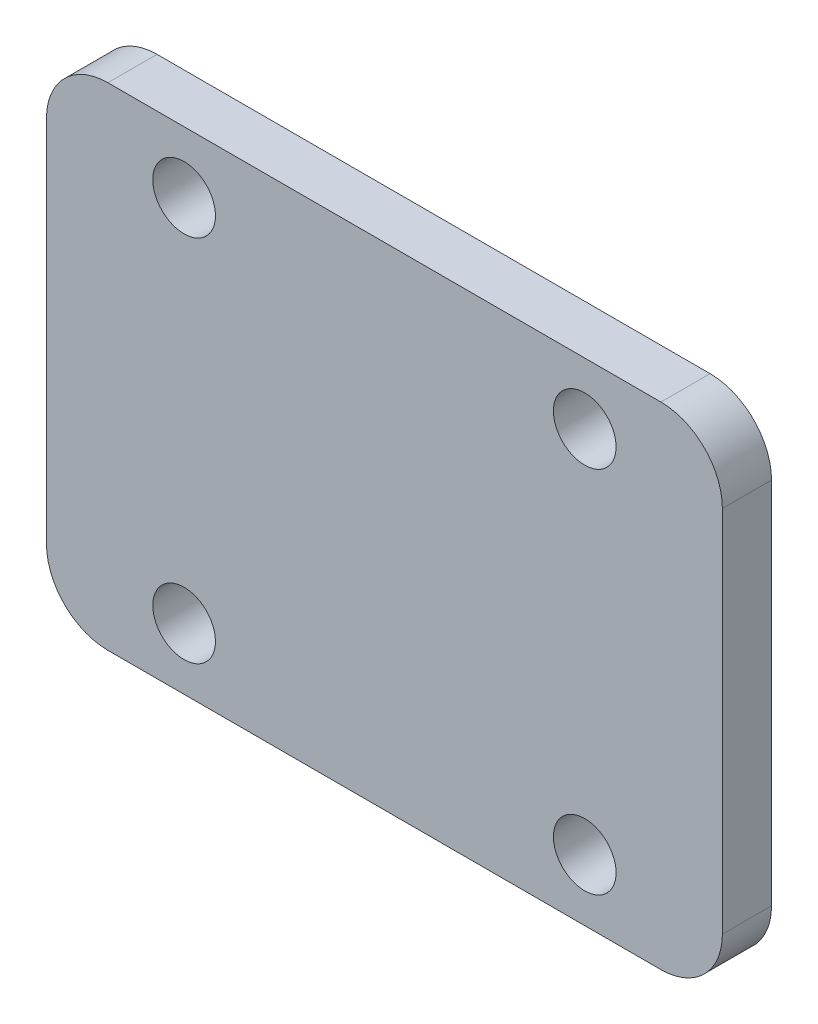
ISO-10303-21;
HEADER;
FILE_DESCRIPTION(('STEP AP214'),'2;1');
FILE_NAME('part.step','',(''),(''),'','','');
FILE_SCHEMA(('AUTOMOTIVE_DESIGN { 1 0 10303 214 1 1 1 1 }'));
ENDSEC;
DATA;
#1=APPLICATION_CONTEXT('core data for automotive mechanical design processes');
#2=APPLICATION_PROTOCOL_DEFINITION('international standard','automotive_design',2000,#1);
#3=PRODUCT_CONTEXT('',#1,'mechanical');
#4=PRODUCT('Part','Part','',(#3));
#5=PRODUCT_RELATED_PRODUCT_CATEGORY('part','',(#4));
#6=PRODUCT_DEFINITION_FORMATION('','',#4);
#7=PRODUCT_DEFINITION_CONTEXT('part definition',#1,'design');
#8=PRODUCT_DEFINITION('design','',#6,#7);
#9=PRODUCT_DEFINITION_SHAPE('','',#8);
#10=(LENGTH_UNIT() NAMED_UNIT(*) SI_UNIT(.MILLI.,.METRE.));
#11=(NAMED_UNIT(*) PLANE_ANGLE_UNIT() SI_UNIT($,.RADIAN.));
#12=(NAMED_UNIT(*) SI_UNIT($,.STERADIAN.) SOLID_ANGLE_UNIT());
#13=UNCERTAINTY_MEASURE_WITH_UNIT(LENGTH_MEASURE(1.E-05),#10,'distance_accuracy_value','');
#14=(GEOMETRIC_REPRESENTATION_CONTEXT(3) GLOBAL_UNCERTAINTY_ASSIGNED_CONTEXT((#13)) GLOBAL_UNIT_ASSIGNED_CONTEXT((#10,
#11,#12)) REPRESENTATION_CONTEXT('',''));
#15=CARTESIAN_POINT('',(0.,0.,0.));
#16=DIRECTION('',(0.,0.,1.));
#17=DIRECTION('',(1.,0.,0.));
#18=AXIS2_PLACEMENT_3D('',#15,#16,#17);
#19=CARTESIAN_POINT('',(-22.5,-15.,4.));
#20=DIRECTION('',(0.,0.,-1.));
#21=DIRECTION('',(-1.,0.,0.));
#22=AXIS2_PLACEMENT_3D('',#19,#20,#21);
#23=PLANE('',#22);
#24=CARTESIAN_POINT('',(-22.5,-15.,4.));
#25=DIRECTION('',(0.,0.,1.));
#26=DIRECTION('',(-1.,0.,0.));
#27=AXIS2_PLACEMENT_3D('',#24,#25,#26);
#28=CIRCLE('',#27,5.);
#29=CARTESIAN_POINT('',(-27.5,-15.,4.));
#30=VERTEX_POINT('',#29);
#31=CARTESIAN_POINT('',(-22.5,-20.,4.));
#32=VERTEX_POINT('',#31);
#33=EDGE_CURVE('E149',#30,#32,#28,.T.);
#34=ORIENTED_EDGE('',*,*,#33,.T.);
#35=DIRECTION('',(1.,0.,0.));
#36=VECTOR('',#35,1.);
#37=CARTESIAN_POINT('',(-22.5,-20.,4.));
#38=LINE('',#37,#36);
#39=CARTESIAN_POINT('',(22.5,-20.,4.));
#40=VERTEX_POINT('',#39);
#41=EDGE_CURVE('E97',#32,#40,#38,.T.);
#42=ORIENTED_EDGE('',*,*,#41,.T.);
#43=CARTESIAN_POINT('',(22.5,-15.,4.));
#44=DIRECTION('',(0.,0.,1.));
#45=DIRECTION('',(1.,0.,0.));
#46=AXIS2_PLACEMENT_3D('',#43,#44,#45);
#47=CIRCLE('',#46,5.);
#48=CARTESIAN_POINT('',(27.5,-15.,4.));
#49=VERTEX_POINT('',#48);
#50=EDGE_CURVE('E164',#40,#49,#47,.T.);
#51=ORIENTED_EDGE('',*,*,#50,.T.);
#52=DIRECTION('',(0.,1.,0.));
#53=VECTOR('',#52,1.);
#54=CARTESIAN_POINT('',(27.5,-15.,4.));
#55=LINE('',#54,#53);
#56=CARTESIAN_POINT('',(27.5,15.,4.));
#57=VERTEX_POINT('',#56);
#58=EDGE_CURVE('E177',#49,#57,#55,.T.);
#59=ORIENTED_EDGE('',*,*,#58,.T.);
#60=CARTESIAN_POINT('',(22.5,15.,4.));
#61=DIRECTION('',(0.,0.,1.));
#62=DIRECTION('',(-1.,0.,0.));
#63=AXIS2_PLACEMENT_3D('',#60,#61,#62);
#64=CIRCLE('',#63,5.);
#65=CARTESIAN_POINT('',(22.5,20.,4.));
#66=VERTEX_POINT('',#65);
#67=EDGE_CURVE('E116',#57,#66,#64,.T.);
#68=ORIENTED_EDGE('',*,*,#67,.T.);
#69=DIRECTION('',(-1.,0.,0.));
#70=VECTOR('',#69,1.);
#71=CARTESIAN_POINT('',(-22.5,20.,4.));
#72=LINE('',#71,#70);
#73=CARTESIAN_POINT('',(-22.5,20.,4.));
#74=VERTEX_POINT('',#73);
#75=EDGE_CURVE('E110',#66,#74,#72,.T.);
#76=ORIENTED_EDGE('',*,*,#75,.T.);
#77=CARTESIAN_POINT('',(-22.5,15.,4.));
#78=DIRECTION('',(0.,0.,1.));
#79=DIRECTION('',(-1.,0.,0.));
#80=AXIS2_PLACEMENT_3D('',#77,#78,#79);
#81=CIRCLE('',#80,5.);
#82=CARTESIAN_POINT('',(-27.5,15.,4.));
#83=VERTEX_POINT('',#82);
#84=EDGE_CURVE('E114',#74,#83,#81,.T.);
#85=ORIENTED_EDGE('',*,*,#84,.T.);
#86=DIRECTION('',(0.,-1.,0.));
#87=VECTOR('',#86,1.);
#88=CARTESIAN_POINT('',(-27.5,-15.,4.));
#89=LINE('',#88,#87);
#90=EDGE_CURVE('E54',#83,#30,#89,.T.);
#91=ORIENTED_EDGE('',*,*,#90,.T.);
#92=EDGE_LOOP('',(#34,#42,#51,#59,#68,#76,#85,#91));
#93=FACE_BOUND('',#92,.T.);
#94=CARTESIAN_POINT('',(-16.3,15.,4.));
#95=DIRECTION('',(0.,0.,1.));
#96=DIRECTION('',(1.,0.,0.));
#97=AXIS2_PLACEMENT_3D('',#94,#95,#96);
#98=CIRCLE('',#97,2.55);
#99=CARTESIAN_POINT('',(-13.75,15.,4.));
#100=VERTEX_POINT('',#99);
#101=EDGE_CURVE('E138',#100,#100,#98,.T.);
#102=ORIENTED_EDGE('',*,*,#101,.F.);
#103=EDGE_LOOP('',(#102));
#104=FACE_BOUND('',#103,.T.);
#105=CARTESIAN_POINT('',(-16.3,-15.,4.));
#106=DIRECTION('',(0.,0.,1.));
#107=DIRECTION('',(-1.,0.,0.));
#108=AXIS2_PLACEMENT_3D('',#105,#106,#107);
#109=CIRCLE('',#108,2.55);
#110=CARTESIAN_POINT('',(-18.85,-15.,4.));
#111=VERTEX_POINT('',#110);
#112=EDGE_CURVE('E186',#111,#111,#109,.T.);
#113=ORIENTED_EDGE('',*,*,#112,.F.);
#114=EDGE_LOOP('',(#113));
#115=FACE_BOUND('',#114,.T.);
#116=CARTESIAN_POINT('',(16.3,-15.,4.));
#117=DIRECTION('',(0.,0.,1.));
#118=DIRECTION('',(1.,0.,0.));
#119=AXIS2_PLACEMENT_3D('',#116,#117,#118);
#120=CIRCLE('',#119,2.55);
#121=CARTESIAN_POINT('',(18.85,-15.,4.));
#122=VERTEX_POINT('',#121);
#123=EDGE_CURVE('E192',#122,#122,#120,.T.);
#124=ORIENTED_EDGE('',*,*,#123,.F.);
#125=EDGE_LOOP('',(#124));
#126=FACE_BOUND('',#125,.T.);
#127=CARTESIAN_POINT('',(16.3,15.,4.));
#128=DIRECTION('',(0.,0.,1.));
#129=DIRECTION('',(-1.,0.,0.));
#130=AXIS2_PLACEMENT_3D('',#127,#128,#129);
#131=CIRCLE('',#130,2.55);
#132=CARTESIAN_POINT('',(13.75,15.,4.));
#133=VERTEX_POINT('',#132);
#134=EDGE_CURVE('E198',#133,#133,#131,.T.);
#135=ORIENTED_EDGE('',*,*,#134,.F.);
#136=EDGE_LOOP('',(#135));
#137=FACE_BOUND('',#136,.T.);
#138=ADVANCED_FACE('F37',(#93,#104,#115,#126,#137),#23,.F.);
#139=CARTESIAN_POINT('',(-22.5,-15.,0.));
#140=DIRECTION('',(0.,0.,-1.));
#141=DIRECTION('',(-1.,0.,0.));
#142=AXIS2_PLACEMENT_3D('',#139,#140,#141);
#143=PLANE('',#142);
#144=CARTESIAN_POINT('',(16.3,-15.,0.));
#145=DIRECTION('',(0.,0.,1.));
#146=DIRECTION('',(1.,0.,0.));
#147=AXIS2_PLACEMENT_3D('',#144,#145,#146);
#148=CIRCLE('',#147,2.55);
#149=CARTESIAN_POINT('',(18.85,-15.,0.));
#150=VERTEX_POINT('',#149);
#151=EDGE_CURVE('E195',#150,#150,#148,.T.);
#152=ORIENTED_EDGE('',*,*,#151,.T.);
#153=EDGE_LOOP('',(#152));
#154=FACE_BOUND('',#153,.T.);
#155=CARTESIAN_POINT('',(-16.3,15.,0.));
#156=DIRECTION('',(0.,0.,1.));
#157=DIRECTION('',(1.,0.,0.));
#158=AXIS2_PLACEMENT_3D('',#155,#156,#157);
#159=CIRCLE('',#158,2.55);
#160=CARTESIAN_POINT('',(-13.75,15.,0.));
#161=VERTEX_POINT('',#160);
#162=EDGE_CURVE('E183',#161,#161,#159,.T.);
#163=ORIENTED_EDGE('',*,*,#162,.T.);
#164=EDGE_LOOP('',(#163));
#165=FACE_BOUND('',#164,.T.);
#166=CARTESIAN_POINT('',(-22.5,-15.,0.));
#167=DIRECTION('',(0.,0.,1.));
#168=DIRECTION('',(-1.,0.,0.));
#169=AXIS2_PLACEMENT_3D('',#166,#167,#168);
#170=CIRCLE('',#169,5.);
#171=CARTESIAN_POINT('',(-27.5,-15.,0.));
#172=VERTEX_POINT('',#171);
#173=CARTESIAN_POINT('',(-22.5,-20.,0.));
#174=VERTEX_POINT('',#173);
#175=EDGE_CURVE('E134',#172,#174,#170,.T.);
#176=ORIENTED_EDGE('',*,*,#175,.F.);
#177=DIRECTION('',(0.,-1.,0.));
#178=VECTOR('',#177,1.);
#179=CARTESIAN_POINT('',(-27.5,-15.,0.));
#180=LINE('',#179,#178);
#181=CARTESIAN_POINT('',(-27.5,15.,0.));
#182=VERTEX_POINT('',#181);
#183=EDGE_CURVE('E89',#182,#172,#180,.T.);
#184=ORIENTED_EDGE('',*,*,#183,.F.);
#185=CARTESIAN_POINT('',(-22.5,15.,0.));
#186=DIRECTION('',(0.,0.,1.));
#187=DIRECTION('',(-1.,0.,0.));
#188=AXIS2_PLACEMENT_3D('',#185,#186,#187);
#189=CIRCLE('',#188,5.);
#190=CARTESIAN_POINT('',(-22.5,20.,0.));
#191=VERTEX_POINT('',#190);
#192=EDGE_CURVE('E83',#191,#182,#189,.T.);
#193=ORIENTED_EDGE('',*,*,#192,.F.);
#194=DIRECTION('',(-1.,0.,0.));
#195=VECTOR('',#194,1.);
#196=CARTESIAN_POINT('',(-22.5,20.,0.));
#197=LINE('',#196,#195);
#198=CARTESIAN_POINT('',(22.5,20.,0.));
#199=VERTEX_POINT('',#198);
#200=EDGE_CURVE('E124',#199,#191,#197,.T.);
#201=ORIENTED_EDGE('',*,*,#200,.F.);
#202=CARTESIAN_POINT('',(22.5,15.,0.));
#203=DIRECTION('',(0.,0.,1.));
#204=DIRECTION('',(-1.,0.,0.));
#205=AXIS2_PLACEMENT_3D('',#202,#203,#204);
#206=CIRCLE('',#205,5.);
#207=CARTESIAN_POINT('',(27.5,15.,0.));
#208=VERTEX_POINT('',#207);
#209=EDGE_CURVE('E144',#208,#199,#206,.T.);
#210=ORIENTED_EDGE('',*,*,#209,.F.);
#211=DIRECTION('',(0.,1.,0.));
#212=VECTOR('',#211,1.);
#213=CARTESIAN_POINT('',(27.5,-15.,0.));
#214=LINE('',#213,#212);
#215=CARTESIAN_POINT('',(27.5,-15.,0.));
#216=VERTEX_POINT('',#215);
#217=EDGE_CURVE('E142',#216,#208,#214,.T.);
#218=ORIENTED_EDGE('',*,*,#217,.F.);
#219=CARTESIAN_POINT('',(22.5,-15.,0.));
#220=DIRECTION('',(0.,0.,1.));
#221=DIRECTION('',(1.,0.,0.));
#222=AXIS2_PLACEMENT_3D('',#219,#220,#221);
#223=CIRCLE('',#222,5.);
#224=CARTESIAN_POINT('',(22.5,-20.,0.));
#225=VERTEX_POINT('',#224);
#226=EDGE_CURVE('E140',#225,#216,#223,.T.);
#227=ORIENTED_EDGE('',*,*,#226,.F.);
#228=DIRECTION('',(1.,0.,0.));
#229=VECTOR('',#228,1.);
#230=CARTESIAN_POINT('',(-22.5,-20.,0.));
#231=LINE('',#230,#229);
#232=EDGE_CURVE('E137',#174,#225,#231,.T.);
#233=ORIENTED_EDGE('',*,*,#232,.F.);
#234=EDGE_LOOP('',(#176,#184,#193,#201,#210,#218,#227,#233));
#235=FACE_BOUND('',#234,.T.);
#236=CARTESIAN_POINT('',(-16.3,-15.,0.));
#237=DIRECTION('',(0.,0.,1.));
#238=DIRECTION('',(-1.,0.,0.));
#239=AXIS2_PLACEMENT_3D('',#236,#237,#238);
#240=CIRCLE('',#239,2.55);
#241=CARTESIAN_POINT('',(-18.85,-15.,0.));
#242=VERTEX_POINT('',#241);
#243=EDGE_CURVE('E189',#242,#242,#240,.T.);
#244=ORIENTED_EDGE('',*,*,#243,.T.);
#245=EDGE_LOOP('',(#244));
#246=FACE_BOUND('',#245,.T.);
#247=CARTESIAN_POINT('',(16.3,15.,0.));
#248=DIRECTION('',(0.,0.,1.));
#249=DIRECTION('',(-1.,0.,0.));
#250=AXIS2_PLACEMENT_3D('',#247,#248,#249);
#251=CIRCLE('',#250,2.55);
#252=CARTESIAN_POINT('',(13.75,15.,0.));
#253=VERTEX_POINT('',#252);
#254=EDGE_CURVE('E201',#253,#253,#251,.T.);
#255=ORIENTED_EDGE('',*,*,#254,.T.);
#256=EDGE_LOOP('',(#255));
#257=FACE_BOUND('',#256,.T.);
#258=ADVANCED_FACE('F168',(#154,#165,#235,#246,#257),#143,.T.);
#259=CARTESIAN_POINT('',(-22.5,-15.,4.));
#260=DIRECTION('',(0.,0.,-1.));
#261=DIRECTION('',(-1.,0.,0.));
#262=AXIS2_PLACEMENT_3D('',#259,#260,#261);
#263=CYLINDRICAL_SURFACE('',#262,5.);
#264=ORIENTED_EDGE('',*,*,#175,.T.);
#265=DIRECTION('',(0.,0.,-1.));
#266=VECTOR('',#265,1.);
#267=CARTESIAN_POINT('',(-22.5,-20.,4.));
#268=LINE('',#267,#266);
#269=EDGE_CURVE('E11',#32,#174,#268,.T.);
#270=ORIENTED_EDGE('',*,*,#269,.F.);
#271=ORIENTED_EDGE('',*,*,#33,.F.);
#272=DIRECTION('',(0.,0.,-1.));
#273=VECTOR('',#272,1.);
#274=CARTESIAN_POINT('',(-27.5,-15.,4.));
#275=LINE('',#274,#273);
#276=EDGE_CURVE('E130',#30,#172,#275,.T.);
#277=ORIENTED_EDGE('',*,*,#276,.T.);
#278=EDGE_LOOP('',(#264,#270,#271,#277));
#279=FACE_BOUND('',#278,.T.);
#280=ADVANCED_FACE('F39',(#279),#263,.T.);
#281=CARTESIAN_POINT('',(-22.5,-20.,4.));
#282=DIRECTION('',(0.,1.,0.));
#283=DIRECTION('',(0.,0.,1.));
#284=AXIS2_PLACEMENT_3D('',#281,#282,#283);
#285=PLANE('',#284);
#286=ORIENTED_EDGE('',*,*,#232,.T.);
#287=DIRECTION('',(0.,0.,-1.));
#288=VECTOR('',#287,1.);
#289=CARTESIAN_POINT('',(22.5,-20.,4.));
#290=LINE('',#289,#288);
#291=EDGE_CURVE('E46',#40,#225,#290,.T.);
#292=ORIENTED_EDGE('',*,*,#291,.F.);
#293=ORIENTED_EDGE('',*,*,#41,.F.);
#294=ORIENTED_EDGE('',*,*,#269,.T.);
#295=EDGE_LOOP('',(#286,#292,#293,#294));
#296=FACE_BOUND('',#295,.T.);
#297=ADVANCED_FACE('F233',(#296),#285,.F.);
#298=CARTESIAN_POINT('',(22.5,-15.,4.));
#299=DIRECTION('',(0.,0.,-1.));
#300=DIRECTION('',(-1.,0.,0.));
#301=AXIS2_PLACEMENT_3D('',#298,#299,#300);
#302=CYLINDRICAL_SURFACE('',#301,5.);
#303=ORIENTED_EDGE('',*,*,#226,.T.);
#304=DIRECTION('',(0.,0.,-1.));
#305=VECTOR('',#304,1.);
#306=CARTESIAN_POINT('',(27.5,-15.,4.));
#307=LINE('',#306,#305);
#308=EDGE_CURVE('E156',#49,#216,#307,.T.);
#309=ORIENTED_EDGE('',*,*,#308,.F.);
#310=ORIENTED_EDGE('',*,*,#50,.F.);
#311=ORIENTED_EDGE('',*,*,#291,.T.);
#312=EDGE_LOOP('',(#303,#309,#310,#311));
#313=FACE_BOUND('',#312,.T.);
#314=ADVANCED_FACE('F162',(#313),#302,.T.);
#315=CARTESIAN_POINT('',(27.5,-15.,4.));
#316=DIRECTION('',(-1.,0.,0.));
#317=DIRECTION('',(0.,0.,1.));
#318=AXIS2_PLACEMENT_3D('',#315,#316,#317);
#319=PLANE('',#318);
#320=ORIENTED_EDGE('',*,*,#217,.T.);
#321=DIRECTION('',(0.,0.,-1.));
#322=VECTOR('',#321,1.);
#323=CARTESIAN_POINT('',(27.5,15.,4.));
#324=LINE('',#323,#322);
#325=EDGE_CURVE('E153',#57,#208,#324,.T.);
#326=ORIENTED_EDGE('',*,*,#325,.F.);
#327=ORIENTED_EDGE('',*,*,#58,.F.);
#328=ORIENTED_EDGE('',*,*,#308,.T.);
#329=EDGE_LOOP('',(#320,#326,#327,#328));
#330=FACE_BOUND('',#329,.T.);
#331=ADVANCED_FACE('F173',(#330),#319,.F.);
#332=CARTESIAN_POINT('',(22.5,15.,4.));
#333=DIRECTION('',(0.,0.,-1.));
#334=DIRECTION('',(-1.,0.,0.));
#335=AXIS2_PLACEMENT_3D('',#332,#333,#334);
#336=CYLINDRICAL_SURFACE('',#335,5.);
#337=ORIENTED_EDGE('',*,*,#209,.T.);
#338=DIRECTION('',(0.,0.,-1.));
#339=VECTOR('',#338,1.);
#340=CARTESIAN_POINT('',(22.5,20.,4.));
#341=LINE('',#340,#339);
#342=EDGE_CURVE('E125',#66,#199,#341,.T.);
#343=ORIENTED_EDGE('',*,*,#342,.F.);
#344=ORIENTED_EDGE('',*,*,#67,.F.);
#345=ORIENTED_EDGE('',*,*,#325,.T.);
#346=EDGE_LOOP('',(#337,#343,#344,#345));
#347=FACE_BOUND('',#346,.T.);
#348=ADVANCED_FACE('F176',(#347),#336,.T.);
#349=CARTESIAN_POINT('',(-22.5,20.,4.));
#350=DIRECTION('',(0.,-1.,0.));
#351=DIRECTION('',(0.,0.,-1.));
#352=AXIS2_PLACEMENT_3D('',#349,#350,#351);
#353=PLANE('',#352);
#354=ORIENTED_EDGE('',*,*,#200,.T.);
#355=DIRECTION('',(0.,0.,-1.));
#356=VECTOR('',#355,1.);
#357=CARTESIAN_POINT('',(-22.5,20.,4.));
#358=LINE('',#357,#356);
#359=EDGE_CURVE('E121',#74,#191,#358,.T.);
#360=ORIENTED_EDGE('',*,*,#359,.F.);
#361=ORIENTED_EDGE('',*,*,#75,.F.);
#362=ORIENTED_EDGE('',*,*,#342,.T.);
#363=EDGE_LOOP('',(#354,#360,#361,#362));
#364=FACE_BOUND('',#363,.T.);
#365=ADVANCED_FACE('F122',(#364),#353,.F.);
#366=CARTESIAN_POINT('',(-22.5,15.,4.));
#367=DIRECTION('',(0.,0.,-1.));
#368=DIRECTION('',(-1.,0.,0.));
#369=AXIS2_PLACEMENT_3D('',#366,#367,#368);
#370=CYLINDRICAL_SURFACE('',#369,5.);
#371=ORIENTED_EDGE('',*,*,#192,.T.);
#372=DIRECTION('',(0.,0.,-1.));
#373=VECTOR('',#372,1.);
#374=CARTESIAN_POINT('',(-27.5,15.,4.));
#375=LINE('',#374,#373);
#376=EDGE_CURVE('E126',#83,#182,#375,.T.);
#377=ORIENTED_EDGE('',*,*,#376,.F.);
#378=ORIENTED_EDGE('',*,*,#84,.F.);
#379=ORIENTED_EDGE('',*,*,#359,.T.);
#380=EDGE_LOOP('',(#371,#377,#378,#379));
#381=FACE_BOUND('',#380,.T.);
#382=ADVANCED_FACE('F128',(#381),#370,.T.);
#383=CARTESIAN_POINT('',(-27.5,-15.,4.));
#384=DIRECTION('',(1.,0.,0.));
#385=DIRECTION('',(0.,0.,-1.));
#386=AXIS2_PLACEMENT_3D('',#383,#384,#385);
#387=PLANE('',#386);
#388=ORIENTED_EDGE('',*,*,#183,.T.);
#389=ORIENTED_EDGE('',*,*,#276,.F.);
#390=ORIENTED_EDGE('',*,*,#90,.F.);
#391=ORIENTED_EDGE('',*,*,#376,.T.);
#392=EDGE_LOOP('',(#388,#389,#390,#391));
#393=FACE_BOUND('',#392,.T.);
#394=ADVANCED_FACE('F221',(#393),#387,.F.);
#395=CARTESIAN_POINT('',(-16.3,15.,4.));
#396=DIRECTION('',(0.,0.,-1.));
#397=DIRECTION('',(-1.,0.,0.));
#398=AXIS2_PLACEMENT_3D('',#395,#396,#397);
#399=CYLINDRICAL_SURFACE('',#398,2.55);
#400=ORIENTED_EDGE('',*,*,#101,.T.);
#401=EDGE_LOOP('',(#400));
#402=FACE_BOUND('',#401,.T.);
#403=ORIENTED_EDGE('',*,*,#162,.F.);
#404=EDGE_LOOP('',(#403));
#405=FACE_BOUND('',#404,.T.);
#406=ADVANCED_FACE('F218',(#402,#405),#399,.F.);
#407=CARTESIAN_POINT('',(-16.3,-15.,4.));
#408=DIRECTION('',(0.,0.,-1.));
#409=DIRECTION('',(-1.,0.,0.));
#410=AXIS2_PLACEMENT_3D('',#407,#408,#409);
#411=CYLINDRICAL_SURFACE('',#410,2.55);
#412=ORIENTED_EDGE('',*,*,#112,.T.);
#413=EDGE_LOOP('',(#412));
#414=FACE_BOUND('',#413,.T.);
#415=ORIENTED_EDGE('',*,*,#243,.F.);
#416=EDGE_LOOP('',(#415));
#417=FACE_BOUND('',#416,.T.);
#418=ADVANCED_FACE('F297',(#414,#417),#411,.F.);
#419=CARTESIAN_POINT('',(16.3,-15.,4.));
#420=DIRECTION('',(0.,0.,-1.));
#421=DIRECTION('',(-1.,0.,0.));
#422=AXIS2_PLACEMENT_3D('',#419,#420,#421);
#423=CYLINDRICAL_SURFACE('',#422,2.55);
#424=ORIENTED_EDGE('',*,*,#123,.T.);
#425=EDGE_LOOP('',(#424));
#426=FACE_BOUND('',#425,.T.);
#427=ORIENTED_EDGE('',*,*,#151,.F.);
#428=EDGE_LOOP('',(#427));
#429=FACE_BOUND('',#428,.T.);
#430=ADVANCED_FACE('F305',(#426,#429),#423,.F.);
#431=CARTESIAN_POINT('',(16.3,15.,4.));
#432=DIRECTION('',(0.,0.,-1.));
#433=DIRECTION('',(-1.,0.,0.));
#434=AXIS2_PLACEMENT_3D('',#431,#432,#433);
#435=CYLINDRICAL_SURFACE('',#434,2.55);
#436=ORIENTED_EDGE('',*,*,#134,.T.);
#437=EDGE_LOOP('',(#436));
#438=FACE_BOUND('',#437,.T.);
#439=ORIENTED_EDGE('',*,*,#254,.F.);
#440=EDGE_LOOP('',(#439));
#441=FACE_BOUND('',#440,.T.);
#442=ADVANCED_FACE('F207',(#438,#441),#435,.F.);
#443=CLOSED_SHELL('',(#138,#258,#280,#297,#314,#331,#348,#365,#382,#394,#406,#418,#430,#442));
#444=MANIFOLD_SOLID_BREP('B2',#443);
#445=ADVANCED_BREP_SHAPE_REPRESENTATION('',(#18,#444),#14);
#446=SHAPE_DEFINITION_REPRESENTATION(#9,#445);
ENDSEC;
END-ISO-10303-21;
